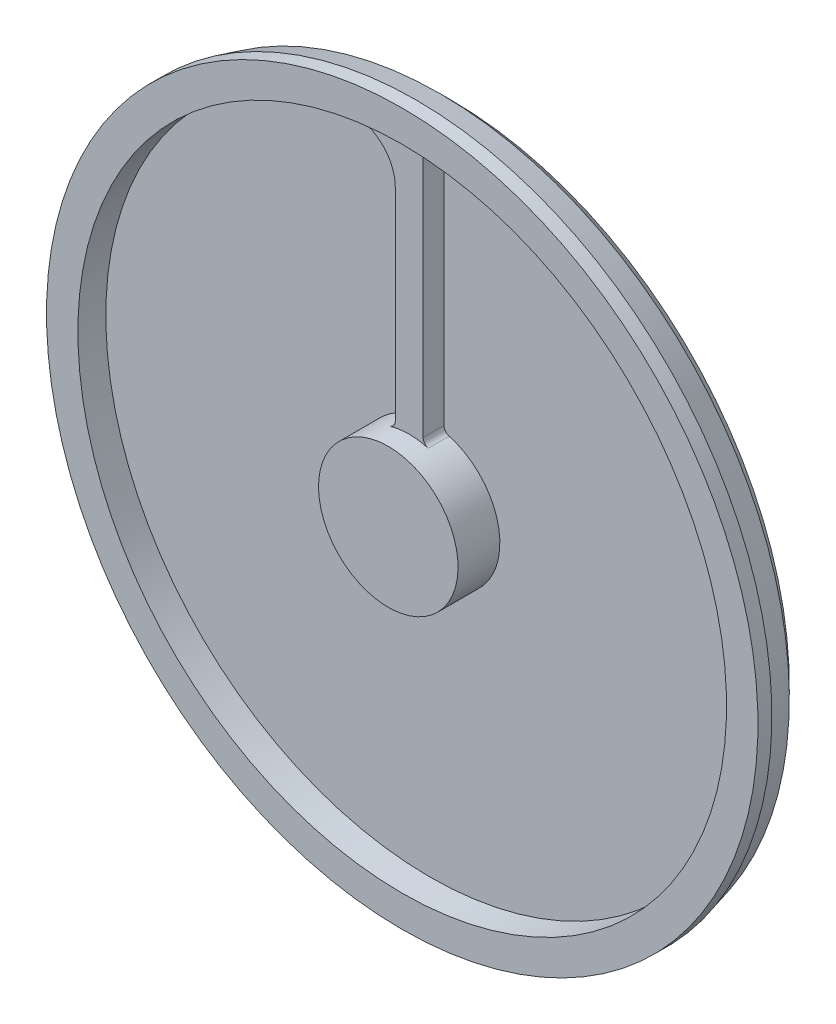
ISO-10303-21;
HEADER;
FILE_DESCRIPTION(('STEP AP214'),'2;1');
FILE_NAME('part.step','',(''),(''),'','','');
FILE_SCHEMA(('AUTOMOTIVE_DESIGN { 1 0 10303 214 1 1 1 1 }'));
ENDSEC;
DATA;
#1=APPLICATION_CONTEXT('core data for automotive mechanical design processes');
#2=APPLICATION_PROTOCOL_DEFINITION('international standard','automotive_design',2000,#1);
#3=PRODUCT_CONTEXT('',#1,'mechanical');
#4=PRODUCT('Part','Part','',(#3));
#5=PRODUCT_RELATED_PRODUCT_CATEGORY('part','',(#4));
#6=PRODUCT_DEFINITION_FORMATION('','',#4);
#7=PRODUCT_DEFINITION_CONTEXT('part definition',#1,'design');
#8=PRODUCT_DEFINITION('design','',#6,#7);
#9=PRODUCT_DEFINITION_SHAPE('','',#8);
#10=(LENGTH_UNIT() NAMED_UNIT(*) SI_UNIT(.MILLI.,.METRE.));
#11=(NAMED_UNIT(*) PLANE_ANGLE_UNIT() SI_UNIT($,.RADIAN.));
#12=(NAMED_UNIT(*) SI_UNIT($,.STERADIAN.) SOLID_ANGLE_UNIT());
#13=UNCERTAINTY_MEASURE_WITH_UNIT(LENGTH_MEASURE(1.E-05),#10,'distance_accuracy_value','');
#14=(GEOMETRIC_REPRESENTATION_CONTEXT(3) GLOBAL_UNCERTAINTY_ASSIGNED_CONTEXT((#13)) GLOBAL_UNIT_ASSIGNED_CONTEXT((#10,
#11,#12)) REPRESENTATION_CONTEXT('',''));
#15=CARTESIAN_POINT('',(0.,0.,0.));
#16=DIRECTION('',(0.,0.,1.));
#17=DIRECTION('',(1.,0.,0.));
#18=AXIS2_PLACEMENT_3D('',#15,#16,#17);
#19=CARTESIAN_POINT('',(0.,0.,0.));
#20=DIRECTION('',(0.,0.,-1.));
#21=DIRECTION('',(0.,1.,0.));
#22=AXIS2_PLACEMENT_3D('',#19,#20,#21);
#23=CYLINDRICAL_SURFACE('',#22,100.);
#24=CARTESIAN_POINT('',(0.,0.,90.));
#25=DIRECTION('',(0.,0.,-1.));
#26=DIRECTION('',(0.,1.,0.));
#27=AXIS2_PLACEMENT_3D('',#24,#25,#26);
#28=CIRCLE('',#27,100.);
#29=CARTESIAN_POINT('',(0.,100.,90.));
#30=VERTEX_POINT('',#29);
#31=EDGE_CURVE('E124',#30,#30,#28,.T.);
#32=ORIENTED_EDGE('',*,*,#31,.T.);
#33=EDGE_LOOP('',(#32));
#34=FACE_BOUND('',#33,.T.);
#35=CARTESIAN_POINT('',(0.,0.,30.));
#36=DIRECTION('',(0.,0.,-1.));
#37=DIRECTION('',(0.,1.,0.));
#38=AXIS2_PLACEMENT_3D('',#35,#36,#37);
#39=CIRCLE('',#38,100.);
#40=CARTESIAN_POINT('',(27.2727272727273,96.2091385841669,30.));
#41=VERTEX_POINT('',#40);
#42=CARTESIAN_POINT('',(-27.2727272727273,96.2091385841669,30.));
#43=VERTEX_POINT('',#42);
#44=EDGE_CURVE('E163',#41,#43,#39,.T.);
#45=ORIENTED_EDGE('',*,*,#44,.F.);
#46=DIRECTION('',(0.,0.,-1.));
#47=VECTOR('',#46,1.);
#48=CARTESIAN_POINT('',(27.2727272727273,96.2091385841669,0.));
#49=LINE('',#48,#47);
#50=CARTESIAN_POINT('',(27.2727272727273,96.2091385841669,60.));
#51=VERTEX_POINT('',#50);
#52=EDGE_CURVE('E193',#41,#51,#49,.F.);
#53=ORIENTED_EDGE('',*,*,#52,.T.);
#54=CARTESIAN_POINT('',(0.,0.,60.));
#55=DIRECTION('',(0.,0.,-1.));
#56=DIRECTION('',(1.,0.,0.));
#57=AXIS2_PLACEMENT_3D('',#54,#55,#56);
#58=CIRCLE('',#57,100.);
#59=CARTESIAN_POINT('',(-27.2727272727273,96.2091385841669,60.));
#60=VERTEX_POINT('',#59);
#61=EDGE_CURVE('E225',#60,#51,#58,.T.);
#62=ORIENTED_EDGE('',*,*,#61,.F.);
#63=DIRECTION('',(0.,0.,-1.));
#64=VECTOR('',#63,1.);
#65=CARTESIAN_POINT('',(-27.2727272727273,96.2091385841669,0.));
#66=LINE('',#65,#64);
#67=EDGE_CURVE('E189',#60,#43,#66,.T.);
#68=ORIENTED_EDGE('',*,*,#67,.T.);
#69=EDGE_LOOP('',(#45,#53,#62,#68));
#70=FACE_BOUND('',#69,.T.);
#71=ADVANCED_FACE('F39',(#34,#70),#23,.T.);
#72=CARTESIAN_POINT('',(0.,100.,30.));
#73=DIRECTION('',(0.,0.,1.));
#74=DIRECTION('',(0.,-1.,0.));
#75=AXIS2_PLACEMENT_3D('',#72,#73,#74);
#76=PLANE('',#75);
#77=DIRECTION('',(0.,1.,0.));
#78=VECTOR('',#77,1.);
#79=CARTESIAN_POINT('',(20.,464.569693372265,30.));
#80=LINE('',#79,#78);
#81=CARTESIAN_POINT('',(20.,105.830052442584,30.));
#82=VERTEX_POINT('',#81);
#83=CARTESIAN_POINT('',(20.,454.009911786075,30.));
#84=VERTEX_POINT('',#83);
#85=EDGE_CURVE('E131',#82,#84,#80,.T.);
#86=ORIENTED_EDGE('',*,*,#85,.F.);
#87=CARTESIAN_POINT('',(30.,105.830052442584,30.));
#88=DIRECTION('',(0.,0.,1.));
#89=DIRECTION('',(0.,-1.,0.));
#90=AXIS2_PLACEMENT_3D('',#87,#88,#89);
#91=CIRCLE('',#90,10.);
#92=EDGE_CURVE('E186',#82,#41,#91,.T.);
#93=ORIENTED_EDGE('',*,*,#92,.T.);
#94=ORIENTED_EDGE('',*,*,#44,.T.);
#95=CARTESIAN_POINT('',(-30.,105.830052442584,30.));
#96=DIRECTION('',(0.,0.,1.));
#97=DIRECTION('',(0.,-1.,0.));
#98=AXIS2_PLACEMENT_3D('',#95,#96,#97);
#99=CIRCLE('',#98,10.);
#100=CARTESIAN_POINT('',(-20.,105.830052442584,30.));
#101=VERTEX_POINT('',#100);
#102=EDGE_CURVE('E129',#43,#101,#99,.T.);
#103=ORIENTED_EDGE('',*,*,#102,.T.);
#104=DIRECTION('',(0.,-1.,0.));
#105=VECTOR('',#104,1.);
#106=CARTESIAN_POINT('',(-20.,464.569693372265,30.));
#107=LINE('',#106,#105);
#108=CARTESIAN_POINT('',(-20.,397.020150622106,30.));
#109=VERTEX_POINT('',#108);
#110=EDGE_CURVE('E121',#109,#101,#107,.T.);
#111=ORIENTED_EDGE('',*,*,#110,.F.);
#112=CARTESIAN_POINT('',(-80.,397.020150622106,30.));
#113=DIRECTION('',(0.,0.,1.));
#114=DIRECTION('',(0.,-1.,0.));
#115=AXIS2_PLACEMENT_3D('',#112,#113,#114);
#116=CIRCLE('',#115,60.);
#117=CARTESIAN_POINT('',(-91.8518518518519,455.83795071427,30.));
#118=VERTEX_POINT('',#117);
#119=EDGE_CURVE('E109',#109,#118,#116,.T.);
#120=ORIENTED_EDGE('',*,*,#119,.T.);
#121=CARTESIAN_POINT('',(0.,0.,30.));
#122=DIRECTION('',(0.,0.,-1.));
#123=DIRECTION('',(0.,1.,0.));
#124=AXIS2_PLACEMENT_3D('',#121,#122,#123);
#125=CIRCLE('',#124,465.);
#126=CARTESIAN_POINT('',(30.6593406593407,463.98815160555,30.));
#127=VERTEX_POINT('',#126);
#128=EDGE_CURVE('E160',#127,#118,#125,.T.);
#129=ORIENTED_EDGE('',*,*,#128,.F.);
#130=CARTESIAN_POINT('',(30.,454.009911786075,30.));
#131=DIRECTION('',(0.,0.,1.));
#132=DIRECTION('',(0.,-1.,0.));
#133=AXIS2_PLACEMENT_3D('',#130,#131,#132);
#134=CIRCLE('',#133,10.);
#135=EDGE_CURVE('E183',#127,#84,#134,.T.);
#136=ORIENTED_EDGE('',*,*,#135,.T.);
#137=EDGE_LOOP('',(#86,#93,#94,#103,#111,#120,#129,#136));
#138=FACE_BOUND('',#137,.T.);
#139=ADVANCED_FACE('F127',(#138),#76,.T.);
#140=CARTESIAN_POINT('',(0.,0.,0.));
#141=DIRECTION('',(0.,0.,-1.));
#142=DIRECTION('',(0.,1.,0.));
#143=AXIS2_PLACEMENT_3D('',#140,#141,#142);
#144=CYLINDRICAL_SURFACE('',#143,465.);
#145=CARTESIAN_POINT('',(0.,0.,70.));
#146=DIRECTION('',(0.,0.,-1.));
#147=DIRECTION('',(0.,1.,0.));
#148=AXIS2_PLACEMENT_3D('',#145,#146,#147);
#149=CIRCLE('',#148,465.);
#150=CARTESIAN_POINT('',(0.,465.,70.));
#151=VERTEX_POINT('',#150);
#152=EDGE_CURVE('E156',#151,#151,#149,.T.);
#153=ORIENTED_EDGE('',*,*,#152,.F.);
#154=EDGE_LOOP('',(#153));
#155=FACE_BOUND('',#154,.T.);
#156=CARTESIAN_POINT('',(0.,0.,60.));
#157=DIRECTION('',(0.,0.,1.));
#158=DIRECTION('',(1.,0.,0.));
#159=AXIS2_PLACEMENT_3D('',#156,#157,#158);
#160=CIRCLE('',#159,465.);
#161=CARTESIAN_POINT('',(30.6593406593407,463.98815160555,60.));
#162=VERTEX_POINT('',#161);
#163=CARTESIAN_POINT('',(-91.8518518518519,455.83795071427,60.));
#164=VERTEX_POINT('',#163);
#165=EDGE_CURVE('E63',#162,#164,#160,.T.);
#166=ORIENTED_EDGE('',*,*,#165,.F.);
#167=DIRECTION('',(0.,0.,-1.));
#168=VECTOR('',#167,1.);
#169=CARTESIAN_POINT('',(30.6593406593407,463.98815160555,0.));
#170=LINE('',#169,#168);
#171=EDGE_CURVE('E197',#162,#127,#170,.T.);
#172=ORIENTED_EDGE('',*,*,#171,.T.);
#173=ORIENTED_EDGE('',*,*,#128,.T.);
#174=DIRECTION('',(0.,0.,-1.));
#175=VECTOR('',#174,1.);
#176=CARTESIAN_POINT('',(-91.8518518518519,455.83795071427,0.));
#177=LINE('',#176,#175);
#178=EDGE_CURVE('E114',#118,#164,#177,.F.);
#179=ORIENTED_EDGE('',*,*,#178,.T.);
#180=EDGE_LOOP('',(#166,#172,#173,#179));
#181=FACE_BOUND('',#180,.T.);
#182=ADVANCED_FACE('F214',(#155,#181),#144,.F.);
#183=CARTESIAN_POINT('',(0.,0.,0.));
#184=DIRECTION('',(0.,0.,-1.));
#185=DIRECTION('',(0.,1.,0.));
#186=AXIS2_PLACEMENT_3D('',#183,#184,#185);
#187=PLANE('',#186);
#188=CARTESIAN_POINT('',(0.,0.,0.));
#189=DIRECTION('',(0.,0.,-1.));
#190=DIRECTION('',(0.,1.,0.));
#191=AXIS2_PLACEMENT_3D('',#188,#189,#190);
#192=CIRCLE('',#191,485.);
#193=CARTESIAN_POINT('',(0.,485.,0.));
#194=VERTEX_POINT('',#193);
#195=EDGE_CURVE('E140',#194,#194,#192,.T.);
#196=ORIENTED_EDGE('',*,*,#195,.T.);
#197=EDGE_LOOP('',(#196));
#198=FACE_BOUND('',#197,.T.);
#199=ADVANCED_FACE('F251',(#198),#187,.T.);
#200=CARTESIAN_POINT('',(0.,0.,90.));
#201=DIRECTION('',(0.,0.,1.));
#202=DIRECTION('',(0.,-1.,0.));
#203=AXIS2_PLACEMENT_3D('',#200,#201,#202);
#204=PLANE('',#203);
#205=ORIENTED_EDGE('',*,*,#31,.F.);
#206=EDGE_LOOP('',(#205));
#207=FACE_BOUND('',#206,.T.);
#208=ADVANCED_FACE('F247',(#207),#204,.T.);
#209=CARTESIAN_POINT('',(0.,465.,70.));
#210=DIRECTION('',(0.,0.,1.));
#211=DIRECTION('',(0.,-1.,0.));
#212=AXIS2_PLACEMENT_3D('',#209,#210,#211);
#213=PLANE('',#212);
#214=ORIENTED_EDGE('',*,*,#152,.T.);
#215=EDGE_LOOP('',(#214));
#216=FACE_BOUND('',#215,.T.);
#217=CARTESIAN_POINT('',(0.,0.,70.));
#218=DIRECTION('',(0.,0.,-1.));
#219=DIRECTION('',(0.,1.,0.));
#220=AXIS2_PLACEMENT_3D('',#217,#218,#219);
#221=CIRCLE('',#220,510.);
#222=CARTESIAN_POINT('',(0.,510.,70.));
#223=VERTEX_POINT('',#222);
#224=EDGE_CURVE('E152',#223,#223,#221,.T.);
#225=ORIENTED_EDGE('',*,*,#224,.F.);
#226=EDGE_LOOP('',(#225));
#227=FACE_BOUND('',#226,.T.);
#228=ADVANCED_FACE('F250',(#216,#227),#213,.T.);
#229=CARTESIAN_POINT('',(0.,0.,0.));
#230=DIRECTION('',(0.,0.,-1.));
#231=DIRECTION('',(0.,1.,0.));
#232=AXIS2_PLACEMENT_3D('',#229,#230,#231);
#233=CYLINDRICAL_SURFACE('',#232,510.);
#234=ORIENTED_EDGE('',*,*,#224,.T.);
#235=EDGE_LOOP('',(#234));
#236=FACE_BOUND('',#235,.T.);
#237=CARTESIAN_POINT('',(0.,0.,50.));
#238=DIRECTION('',(0.,0.,-1.));
#239=DIRECTION('',(0.,1.,0.));
#240=AXIS2_PLACEMENT_3D('',#237,#238,#239);
#241=CIRCLE('',#240,510.);
#242=CARTESIAN_POINT('',(0.,510.,50.));
#243=VERTEX_POINT('',#242);
#244=EDGE_CURVE('E148',#243,#243,#241,.T.);
#245=ORIENTED_EDGE('',*,*,#244,.F.);
#246=EDGE_LOOP('',(#245));
#247=FACE_BOUND('',#246,.T.);
#248=ADVANCED_FACE('F334',(#236,#247),#233,.T.);
#249=CARTESIAN_POINT('',(0.,0.,15.8493649053887));
#250=DIRECTION('',(0.,0.,1.));
#251=DIRECTION('',(0.,-1.,0.));
#252=AXIS2_PLACEMENT_3D('',#249,#250,#251);
#253=CONICAL_SURFACE('',#252,500.849364905389,0.261799387799152);
#254=ORIENTED_EDGE('',*,*,#244,.T.);
#255=EDGE_LOOP('',(#254));
#256=FACE_BOUND('',#255,.T.);
#257=CARTESIAN_POINT('',(0.,0.,15.8493649053887));
#258=DIRECTION('',(0.,0.,-1.));
#259=DIRECTION('',(0.,1.,0.));
#260=AXIS2_PLACEMENT_3D('',#257,#258,#259);
#261=CIRCLE('',#260,500.849364905389);
#262=CARTESIAN_POINT('',(0.,500.849364905389,15.8493649053888));
#263=VERTEX_POINT('',#262);
#264=EDGE_CURVE('E144',#263,#263,#261,.T.);
#265=ORIENTED_EDGE('',*,*,#264,.F.);
#266=EDGE_LOOP('',(#265));
#267=FACE_BOUND('',#266,.T.);
#268=ADVANCED_FACE('F325',(#256,#267),#253,.T.);
#269=CARTESIAN_POINT('',(0.,0.,0.));
#270=DIRECTION('',(0.,0.,1.));
#271=DIRECTION('',(0.,-1.,0.));
#272=AXIS2_PLACEMENT_3D('',#269,#270,#271);
#273=CONICAL_SURFACE('',#272,485.,0.785398163397453);
#274=ORIENTED_EDGE('',*,*,#264,.T.);
#275=EDGE_LOOP('',(#274));
#276=FACE_BOUND('',#275,.T.);
#277=ORIENTED_EDGE('',*,*,#195,.F.);
#278=EDGE_LOOP('',(#277));
#279=FACE_BOUND('',#278,.T.);
#280=ADVANCED_FACE('F302',(#276,#279),#273,.T.);
#281=CARTESIAN_POINT('',(-20.,464.569693372265,60.));
#282=DIRECTION('',(1.,0.,0.));
#283=DIRECTION('',(0.,1.,0.));
#284=AXIS2_PLACEMENT_3D('',#281,#282,#283);
#285=PLANE('',#284);
#286=ORIENTED_EDGE('',*,*,#110,.T.);
#287=DIRECTION('',(0.,0.,-1.));
#288=VECTOR('',#287,1.);
#289=CARTESIAN_POINT('',(-20.,105.830052442584,60.));
#290=LINE('',#289,#288);
#291=CARTESIAN_POINT('',(-20.,105.830052442584,60.));
#292=VERTEX_POINT('',#291);
#293=EDGE_CURVE('E55',#101,#292,#290,.F.);
#294=ORIENTED_EDGE('',*,*,#293,.T.);
#295=DIRECTION('',(0.,-1.,0.));
#296=VECTOR('',#295,1.);
#297=CARTESIAN_POINT('',(-20.,464.569693372265,60.));
#298=LINE('',#297,#296);
#299=CARTESIAN_POINT('',(-20.,397.020150622106,60.));
#300=VERTEX_POINT('',#299);
#301=EDGE_CURVE('E122',#300,#292,#298,.T.);
#302=ORIENTED_EDGE('',*,*,#301,.F.);
#303=DIRECTION('',(0.,0.,-1.));
#304=VECTOR('',#303,1.);
#305=CARTESIAN_POINT('',(-20.,397.020150622106,60.));
#306=LINE('',#305,#304);
#307=EDGE_CURVE('E113',#300,#109,#306,.T.);
#308=ORIENTED_EDGE('',*,*,#307,.T.);
#309=EDGE_LOOP('',(#286,#294,#302,#308));
#310=FACE_BOUND('',#309,.T.);
#311=ADVANCED_FACE('F120',(#310),#285,.F.);
#312=CARTESIAN_POINT('',(20.,464.569693372265,60.));
#313=DIRECTION('',(-1.,0.,0.));
#314=DIRECTION('',(0.,-1.,0.));
#315=AXIS2_PLACEMENT_3D('',#312,#313,#314);
#316=PLANE('',#315);
#317=DIRECTION('',(0.,1.,0.));
#318=VECTOR('',#317,1.);
#319=CARTESIAN_POINT('',(20.,464.569693372265,60.));
#320=LINE('',#319,#318);
#321=CARTESIAN_POINT('',(20.,105.830052442584,60.));
#322=VERTEX_POINT('',#321);
#323=CARTESIAN_POINT('',(20.,454.009911786075,60.));
#324=VERTEX_POINT('',#323);
#325=EDGE_CURVE('E137',#322,#324,#320,.T.);
#326=ORIENTED_EDGE('',*,*,#325,.F.);
#327=DIRECTION('',(0.,0.,-1.));
#328=VECTOR('',#327,1.);
#329=CARTESIAN_POINT('',(20.,105.830052442584,60.));
#330=LINE('',#329,#328);
#331=EDGE_CURVE('E177',#322,#82,#330,.T.);
#332=ORIENTED_EDGE('',*,*,#331,.T.);
#333=ORIENTED_EDGE('',*,*,#85,.T.);
#334=DIRECTION('',(0.,0.,-1.));
#335=VECTOR('',#334,1.);
#336=CARTESIAN_POINT('',(20.,454.009911786075,60.));
#337=LINE('',#336,#335);
#338=EDGE_CURVE('E174',#84,#324,#337,.F.);
#339=ORIENTED_EDGE('',*,*,#338,.T.);
#340=EDGE_LOOP('',(#326,#332,#333,#339));
#341=FACE_BOUND('',#340,.T.);
#342=ADVANCED_FACE('F216',(#341),#316,.F.);
#343=CARTESIAN_POINT('',(0.,0.,60.));
#344=DIRECTION('',(0.,0.,1.));
#345=DIRECTION('',(1.,0.,0.));
#346=AXIS2_PLACEMENT_3D('',#343,#344,#345);
#347=PLANE('',#346);
#348=ORIENTED_EDGE('',*,*,#165,.T.);
#349=CARTESIAN_POINT('',(-80.,397.020150622106,60.));
#350=DIRECTION('',(0.,0.,1.));
#351=DIRECTION('',(1.,0.,0.));
#352=AXIS2_PLACEMENT_3D('',#349,#350,#351);
#353=CIRCLE('',#352,60.);
#354=EDGE_CURVE('E171',#164,#300,#353,.F.);
#355=ORIENTED_EDGE('',*,*,#354,.T.);
#356=ORIENTED_EDGE('',*,*,#301,.T.);
#357=CARTESIAN_POINT('',(-30.,105.830052442584,60.));
#358=DIRECTION('',(0.,0.,1.));
#359=DIRECTION('',(1.,0.,0.));
#360=AXIS2_PLACEMENT_3D('',#357,#358,#359);
#361=CIRCLE('',#360,10.);
#362=EDGE_CURVE('E11',#292,#60,#361,.F.);
#363=ORIENTED_EDGE('',*,*,#362,.T.);
#364=ORIENTED_EDGE('',*,*,#61,.T.);
#365=CARTESIAN_POINT('',(30.,105.830052442584,60.));
#366=DIRECTION('',(0.,0.,1.));
#367=DIRECTION('',(1.,0.,0.));
#368=AXIS2_PLACEMENT_3D('',#365,#366,#367);
#369=CIRCLE('',#368,10.);
#370=EDGE_CURVE('E202',#51,#322,#369,.F.);
#371=ORIENTED_EDGE('',*,*,#370,.T.);
#372=ORIENTED_EDGE('',*,*,#325,.T.);
#373=CARTESIAN_POINT('',(30.,454.009911786075,60.));
#374=DIRECTION('',(0.,0.,1.));
#375=DIRECTION('',(1.,0.,0.));
#376=AXIS2_PLACEMENT_3D('',#373,#374,#375);
#377=CIRCLE('',#376,10.);
#378=EDGE_CURVE('E48',#324,#162,#377,.F.);
#379=ORIENTED_EDGE('',*,*,#378,.T.);
#380=EDGE_LOOP('',(#348,#355,#356,#363,#364,#371,#372,#379));
#381=FACE_BOUND('',#380,.T.);
#382=ADVANCED_FACE('F209',(#381),#347,.T.);
#383=CARTESIAN_POINT('',(-80.,397.020150622106,0.));
#384=DIRECTION('',(0.,0.,-1.));
#385=DIRECTION('',(0.,1.,0.));
#386=AXIS2_PLACEMENT_3D('',#383,#384,#385);
#387=CYLINDRICAL_SURFACE('',#386,60.);
#388=ORIENTED_EDGE('',*,*,#354,.F.);
#389=ORIENTED_EDGE('',*,*,#178,.F.);
#390=ORIENTED_EDGE('',*,*,#119,.F.);
#391=ORIENTED_EDGE('',*,*,#307,.F.);
#392=EDGE_LOOP('',(#388,#389,#390,#391));
#393=FACE_BOUND('',#392,.T.);
#394=ADVANCED_FACE('F112',(#393),#387,.F.);
#395=CARTESIAN_POINT('',(30.,105.830052442584,0.));
#396=DIRECTION('',(0.,0.,-1.));
#397=DIRECTION('',(0.,1.,0.));
#398=AXIS2_PLACEMENT_3D('',#395,#396,#397);
#399=CYLINDRICAL_SURFACE('',#398,10.);
#400=ORIENTED_EDGE('',*,*,#370,.F.);
#401=ORIENTED_EDGE('',*,*,#52,.F.);
#402=ORIENTED_EDGE('',*,*,#92,.F.);
#403=ORIENTED_EDGE('',*,*,#331,.F.);
#404=EDGE_LOOP('',(#400,#401,#402,#403));
#405=FACE_BOUND('',#404,.T.);
#406=ADVANCED_FACE('F220',(#405),#399,.F.);
#407=CARTESIAN_POINT('',(30.,454.009911786075,0.));
#408=DIRECTION('',(0.,0.,-1.));
#409=DIRECTION('',(0.,1.,0.));
#410=AXIS2_PLACEMENT_3D('',#407,#408,#409);
#411=CYLINDRICAL_SURFACE('',#410,10.);
#412=ORIENTED_EDGE('',*,*,#378,.F.);
#413=ORIENTED_EDGE('',*,*,#338,.F.);
#414=ORIENTED_EDGE('',*,*,#135,.F.);
#415=ORIENTED_EDGE('',*,*,#171,.F.);
#416=EDGE_LOOP('',(#412,#413,#414,#415));
#417=FACE_BOUND('',#416,.T.);
#418=ADVANCED_FACE('F213',(#417),#411,.F.);
#419=CARTESIAN_POINT('',(-30.,105.830052442584,0.));
#420=DIRECTION('',(0.,0.,-1.));
#421=DIRECTION('',(0.,1.,0.));
#422=AXIS2_PLACEMENT_3D('',#419,#420,#421);
#423=CYLINDRICAL_SURFACE('',#422,10.);
#424=ORIENTED_EDGE('',*,*,#362,.F.);
#425=ORIENTED_EDGE('',*,*,#293,.F.);
#426=ORIENTED_EDGE('',*,*,#102,.F.);
#427=ORIENTED_EDGE('',*,*,#67,.F.);
#428=EDGE_LOOP('',(#424,#425,#426,#427));
#429=FACE_BOUND('',#428,.T.);
#430=ADVANCED_FACE('F41',(#429),#423,.F.);
#431=CLOSED_SHELL('',(#71,#139,#182,#199,#208,#228,#248,#268,#280,#311,#342,#382,#394,#406,#418,#430));
#432=MANIFOLD_SOLID_BREP('B2',#431);
#433=ADVANCED_BREP_SHAPE_REPRESENTATION('',(#18,#432),#14);
#434=SHAPE_DEFINITION_REPRESENTATION(#9,#433);
ENDSEC;
END-ISO-10303-21;
